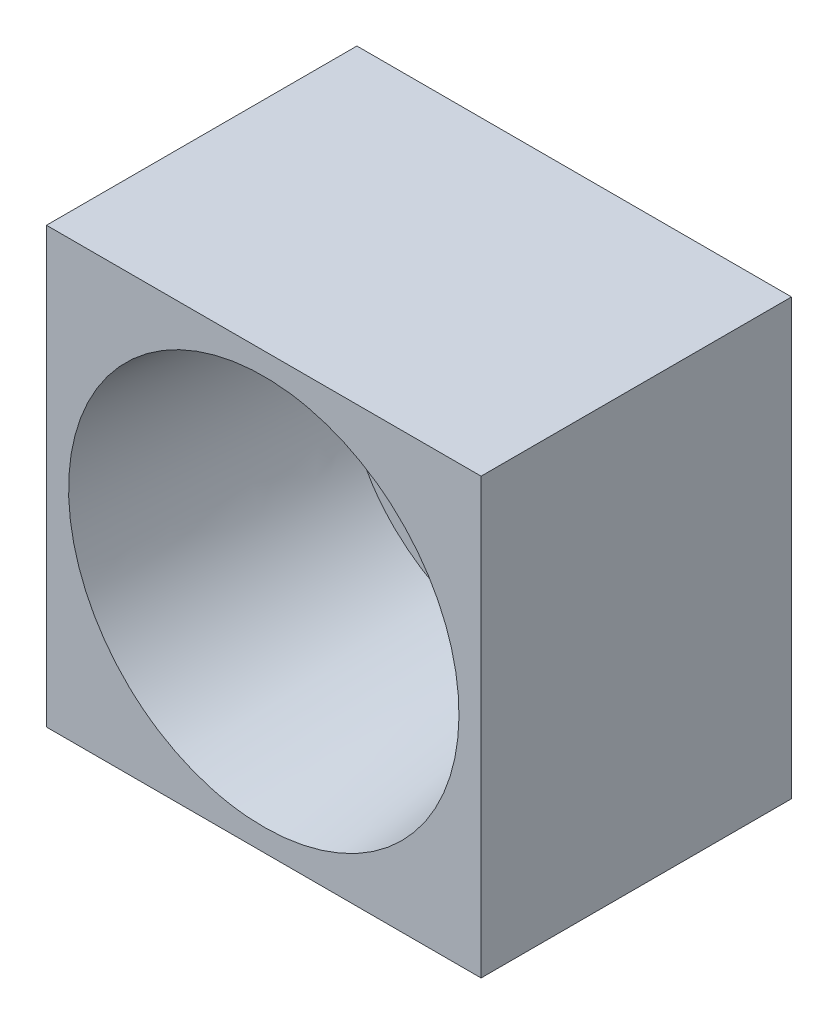
ISO-10303-21;
HEADER;
FILE_DESCRIPTION(('STEP AP214'),'2;1');
FILE_NAME('part.step','',(''),(''),'','','');
FILE_SCHEMA(('AUTOMOTIVE_DESIGN { 1 0 10303 214 1 1 1 1 }'));
ENDSEC;
DATA;
#1=APPLICATION_CONTEXT('core data for automotive mechanical design processes');
#2=APPLICATION_PROTOCOL_DEFINITION('international standard','automotive_design',2000,#1);
#3=PRODUCT_CONTEXT('',#1,'mechanical');
#4=PRODUCT('Part','Part','',(#3));
#5=PRODUCT_RELATED_PRODUCT_CATEGORY('part','',(#4));
#6=PRODUCT_DEFINITION_FORMATION('','',#4);
#7=PRODUCT_DEFINITION_CONTEXT('part definition',#1,'design');
#8=PRODUCT_DEFINITION('design','',#6,#7);
#9=PRODUCT_DEFINITION_SHAPE('','',#8);
#10=(LENGTH_UNIT() NAMED_UNIT(*) SI_UNIT(.MILLI.,.METRE.));
#11=(NAMED_UNIT(*) PLANE_ANGLE_UNIT() SI_UNIT($,.RADIAN.));
#12=(NAMED_UNIT(*) SI_UNIT($,.STERADIAN.) SOLID_ANGLE_UNIT());
#13=UNCERTAINTY_MEASURE_WITH_UNIT(LENGTH_MEASURE(1.E-05),#10,'distance_accuracy_value','');
#14=(GEOMETRIC_REPRESENTATION_CONTEXT(3) GLOBAL_UNCERTAINTY_ASSIGNED_CONTEXT((#13)) GLOBAL_UNIT_ASSIGNED_CONTEXT((#10,
#11,#12)) REPRESENTATION_CONTEXT('',''));
#15=CARTESIAN_POINT('',(0.,0.,0.));
#16=DIRECTION('',(0.,0.,1.));
#17=DIRECTION('',(1.,0.,0.));
#18=AXIS2_PLACEMENT_3D('',#15,#16,#17);
#19=CARTESIAN_POINT('',(0.,0.,50.));
#20=DIRECTION('',(-1.,0.,0.));
#21=DIRECTION('',(0.,-1.,0.));
#22=AXIS2_PLACEMENT_3D('',#19,#20,#21);
#23=PLANE('',#22);
#24=DIRECTION('',(0.,1.,0.));
#25=VECTOR('',#24,1.);
#26=CARTESIAN_POINT('',(0.,0.,0.));
#27=LINE('',#26,#25);
#28=CARTESIAN_POINT('',(0.,-70.,0.));
#29=VERTEX_POINT('',#28);
#30=CARTESIAN_POINT('',(0.,0.,0.));
#31=VERTEX_POINT('',#30);
#32=EDGE_CURVE('E103',#29,#31,#27,.T.);
#33=ORIENTED_EDGE('',*,*,#32,.T.);
#34=DIRECTION('',(0.,0.,-1.));
#35=VECTOR('',#34,1.);
#36=CARTESIAN_POINT('',(0.,0.,50.));
#37=LINE('',#36,#35);
#38=CARTESIAN_POINT('',(0.,0.,50.));
#39=VERTEX_POINT('',#38);
#40=EDGE_CURVE('E12',#39,#31,#37,.T.);
#41=ORIENTED_EDGE('',*,*,#40,.F.);
#42=DIRECTION('',(0.,1.,0.));
#43=VECTOR('',#42,1.);
#44=CARTESIAN_POINT('',(0.,0.,50.));
#45=LINE('',#44,#43);
#46=CARTESIAN_POINT('',(0.,-70.,50.));
#47=VERTEX_POINT('',#46);
#48=EDGE_CURVE('E91',#47,#39,#45,.T.);
#49=ORIENTED_EDGE('',*,*,#48,.F.);
#50=DIRECTION('',(0.,0.,-1.));
#51=VECTOR('',#50,1.);
#52=CARTESIAN_POINT('',(0.,-70.,50.));
#53=LINE('',#52,#51);
#54=EDGE_CURVE('E99',#47,#29,#53,.T.);
#55=ORIENTED_EDGE('',*,*,#54,.T.);
#56=EDGE_LOOP('',(#33,#41,#49,#55));
#57=FACE_BOUND('',#56,.T.);
#58=ADVANCED_FACE('F40',(#57),#23,.F.);
#59=CARTESIAN_POINT('',(0.,0.,50.));
#60=DIRECTION('',(0.,-1.,0.));
#61=DIRECTION('',(1.,0.,0.));
#62=AXIS2_PLACEMENT_3D('',#59,#60,#61);
#63=PLANE('',#62);
#64=DIRECTION('',(-1.,0.,0.));
#65=VECTOR('',#64,1.);
#66=CARTESIAN_POINT('',(0.,0.,0.));
#67=LINE('',#66,#65);
#68=CARTESIAN_POINT('',(-70.,0.,0.));
#69=VERTEX_POINT('',#68);
#70=EDGE_CURVE('E95',#31,#69,#67,.T.);
#71=ORIENTED_EDGE('',*,*,#70,.T.);
#72=DIRECTION('',(0.,0.,-1.));
#73=VECTOR('',#72,1.);
#74=CARTESIAN_POINT('',(-70.,0.,50.));
#75=LINE('',#74,#73);
#76=CARTESIAN_POINT('',(-70.,0.,50.));
#77=VERTEX_POINT('',#76);
#78=EDGE_CURVE('E48',#77,#69,#75,.T.);
#79=ORIENTED_EDGE('',*,*,#78,.F.);
#80=DIRECTION('',(-1.,0.,0.));
#81=VECTOR('',#80,1.);
#82=CARTESIAN_POINT('',(0.,0.,50.));
#83=LINE('',#82,#81);
#84=EDGE_CURVE('E86',#39,#77,#83,.T.);
#85=ORIENTED_EDGE('',*,*,#84,.F.);
#86=ORIENTED_EDGE('',*,*,#40,.T.);
#87=EDGE_LOOP('',(#71,#79,#85,#86));
#88=FACE_BOUND('',#87,.T.);
#89=ADVANCED_FACE('F94',(#88),#63,.F.);
#90=CARTESIAN_POINT('',(-70.,0.,50.));
#91=DIRECTION('',(1.,0.,0.));
#92=DIRECTION('',(0.,1.,0.));
#93=AXIS2_PLACEMENT_3D('',#90,#91,#92);
#94=PLANE('',#93);
#95=DIRECTION('',(0.,-1.,0.));
#96=VECTOR('',#95,1.);
#97=CARTESIAN_POINT('',(-70.,0.,0.));
#98=LINE('',#97,#96);
#99=CARTESIAN_POINT('',(-70.,-70.,0.));
#100=VERTEX_POINT('',#99);
#101=EDGE_CURVE('E73',#69,#100,#98,.T.);
#102=ORIENTED_EDGE('',*,*,#101,.T.);
#103=DIRECTION('',(0.,0.,-1.));
#104=VECTOR('',#103,1.);
#105=CARTESIAN_POINT('',(-70.,-70.,50.));
#106=LINE('',#105,#104);
#107=CARTESIAN_POINT('',(-70.,-70.,50.));
#108=VERTEX_POINT('',#107);
#109=EDGE_CURVE('E96',#108,#100,#106,.T.);
#110=ORIENTED_EDGE('',*,*,#109,.F.);
#111=DIRECTION('',(0.,-1.,0.));
#112=VECTOR('',#111,1.);
#113=CARTESIAN_POINT('',(-70.,0.,50.));
#114=LINE('',#113,#112);
#115=EDGE_CURVE('E89',#77,#108,#114,.T.);
#116=ORIENTED_EDGE('',*,*,#115,.F.);
#117=ORIENTED_EDGE('',*,*,#78,.T.);
#118=EDGE_LOOP('',(#102,#110,#116,#117));
#119=FACE_BOUND('',#118,.T.);
#120=ADVANCED_FACE('F97',(#119),#94,.F.);
#121=CARTESIAN_POINT('',(0.,-70.,50.));
#122=DIRECTION('',(0.,1.,0.));
#123=DIRECTION('',(-1.,0.,0.));
#124=AXIS2_PLACEMENT_3D('',#121,#122,#123);
#125=PLANE('',#124);
#126=DIRECTION('',(1.,0.,0.));
#127=VECTOR('',#126,1.);
#128=CARTESIAN_POINT('',(0.,-70.,0.));
#129=LINE('',#128,#127);
#130=EDGE_CURVE('E79',#100,#29,#129,.T.);
#131=ORIENTED_EDGE('',*,*,#130,.T.);
#132=ORIENTED_EDGE('',*,*,#54,.F.);
#133=DIRECTION('',(1.,0.,0.));
#134=VECTOR('',#133,1.);
#135=CARTESIAN_POINT('',(0.,-70.,50.));
#136=LINE('',#135,#134);
#137=EDGE_CURVE('E56',#108,#47,#136,.T.);
#138=ORIENTED_EDGE('',*,*,#137,.F.);
#139=ORIENTED_EDGE('',*,*,#109,.T.);
#140=EDGE_LOOP('',(#131,#132,#138,#139));
#141=FACE_BOUND('',#140,.T.);
#142=ADVANCED_FACE('F111',(#141),#125,.F.);
#143=CARTESIAN_POINT('',(0.,0.,50.));
#144=DIRECTION('',(0.,0.,-1.));
#145=DIRECTION('',(-1.,0.,0.));
#146=AXIS2_PLACEMENT_3D('',#143,#144,#145);
#147=PLANE('',#146);
#148=CARTESIAN_POINT('',(-35.,-35.,50.));
#149=DIRECTION('',(0.,0.,1.));
#150=DIRECTION('',(1.,0.,0.));
#151=AXIS2_PLACEMENT_3D('',#148,#149,#150);
#152=CIRCLE('',#151,31.4406587294673);
#153=CARTESIAN_POINT('',(-22.0797245840609,-6.33675690855778,50.));
#154=VERTEX_POINT('',#153);
#155=EDGE_CURVE('E106',#154,#154,#152,.T.);
#156=ORIENTED_EDGE('',*,*,#155,.F.);
#157=EDGE_LOOP('',(#156));
#158=FACE_BOUND('',#157,.T.);
#159=ORIENTED_EDGE('',*,*,#48,.T.);
#160=ORIENTED_EDGE('',*,*,#84,.T.);
#161=ORIENTED_EDGE('',*,*,#115,.T.);
#162=ORIENTED_EDGE('',*,*,#137,.T.);
#163=EDGE_LOOP('',(#159,#160,#161,#162));
#164=FACE_BOUND('',#163,.T.);
#165=ADVANCED_FACE('F87',(#158,#164),#147,.F.);
#166=CARTESIAN_POINT('',(0.,0.,0.));
#167=DIRECTION('',(0.,0.,-1.));
#168=DIRECTION('',(-1.,0.,0.));
#169=AXIS2_PLACEMENT_3D('',#166,#167,#168);
#170=PLANE('',#169);
#171=CARTESIAN_POINT('',(-27.5,-35.,0.));
#172=DIRECTION('',(0.,0.,-1.));
#173=DIRECTION('',(-1.,0.,0.));
#174=AXIS2_PLACEMENT_3D('',#171,#172,#173);
#175=CIRCLE('',#174,2.5);
#176=CARTESIAN_POINT('',(-30.,-35.,0.));
#177=VERTEX_POINT('',#176);
#178=EDGE_CURVE('E124',#177,#177,#175,.T.);
#179=ORIENTED_EDGE('',*,*,#178,.F.);
#180=EDGE_LOOP('',(#179));
#181=FACE_BOUND('',#180,.T.);
#182=CARTESIAN_POINT('',(-42.5,-35.,0.));
#183=DIRECTION('',(0.,0.,-1.));
#184=DIRECTION('',(-1.,0.,0.));
#185=AXIS2_PLACEMENT_3D('',#182,#183,#184);
#186=CIRCLE('',#185,2.5);
#187=CARTESIAN_POINT('',(-45.,-35.,0.));
#188=VERTEX_POINT('',#187);
#189=EDGE_CURVE('E168',#188,#188,#186,.T.);
#190=ORIENTED_EDGE('',*,*,#189,.F.);
#191=EDGE_LOOP('',(#190));
#192=FACE_BOUND('',#191,.T.);
#193=ORIENTED_EDGE('',*,*,#32,.F.);
#194=ORIENTED_EDGE('',*,*,#130,.F.);
#195=ORIENTED_EDGE('',*,*,#101,.F.);
#196=ORIENTED_EDGE('',*,*,#70,.F.);
#197=EDGE_LOOP('',(#193,#194,#195,#196));
#198=FACE_BOUND('',#197,.T.);
#199=ADVANCED_FACE('F114',(#181,#192,#198),#170,.T.);
#200=CARTESIAN_POINT('',(-35.,-35.,10.));
#201=DIRECTION('',(0.,0.,1.));
#202=DIRECTION('',(1.,0.,0.));
#203=AXIS2_PLACEMENT_3D('',#200,#201,#202);
#204=PLANE('',#203);
#205=CARTESIAN_POINT('',(-27.5,-35.,10.));
#206=DIRECTION('',(0.,0.,1.));
#207=DIRECTION('',(1.,0.,0.));
#208=AXIS2_PLACEMENT_3D('',#205,#206,#207);
#209=CIRCLE('',#208,2.5);
#210=CARTESIAN_POINT('',(-25.,-35.,10.));
#211=VERTEX_POINT('',#210);
#212=EDGE_CURVE('E171',#211,#211,#209,.T.);
#213=ORIENTED_EDGE('',*,*,#212,.F.);
#214=EDGE_LOOP('',(#213));
#215=FACE_BOUND('',#214,.T.);
#216=CARTESIAN_POINT('',(-42.5,-35.,10.));
#217=DIRECTION('',(0.,0.,1.));
#218=DIRECTION('',(-1.,0.,0.));
#219=AXIS2_PLACEMENT_3D('',#216,#217,#218);
#220=CIRCLE('',#219,2.5);
#221=CARTESIAN_POINT('',(-45.,-35.,10.));
#222=VERTEX_POINT('',#221);
#223=EDGE_CURVE('E172',#222,#222,#220,.T.);
#224=ORIENTED_EDGE('',*,*,#223,.F.);
#225=EDGE_LOOP('',(#224));
#226=FACE_BOUND('',#225,.T.);
#227=CARTESIAN_POINT('',(-35.,-35.,10.));
#228=DIRECTION('',(0.,0.,1.));
#229=DIRECTION('',(1.,0.,0.));
#230=AXIS2_PLACEMENT_3D('',#227,#228,#229);
#231=CIRCLE('',#230,27.);
#232=CARTESIAN_POINT('',(-19.3087460690092,-13.0276412264599,10.));
#233=VERTEX_POINT('',#232);
#234=EDGE_CURVE('E119',#233,#233,#231,.T.);
#235=ORIENTED_EDGE('',*,*,#234,.T.);
#236=EDGE_LOOP('',(#235));
#237=FACE_BOUND('',#236,.T.);
#238=ADVANCED_FACE('F130',(#215,#226,#237),#204,.T.);
#239=CARTESIAN_POINT('',(-19.3087460690092,-13.0276412264599,10.));
#240=CARTESIAN_POINT('',(-22.0797245840609,-6.33675690855778,50.));
#241=CARTESIAN_POINT('',(-63.2534636160894,18.3548666355217,10.));
#242=CARTESIAN_POINT('',(-79.4062107669454,19.5037939233204,50.));
#243=CARTESIAN_POINT('',(-94.6359714780711,-25.5898509115585,10.));
#244=CARTESIAN_POINT('',(-105.246761598824,-37.8226922595641,50.));
#245=CARTESIAN_POINT('',(-50.6912539309908,-56.9723587735401,10.));
#246=CARTESIAN_POINT('',(-47.9202754159391,-63.6632430914422,50.));
#247=CARTESIAN_POINT('',(-6.74653638391059,-88.3548666355217,10.));
#248=CARTESIAN_POINT('',(9.40621076694536,-89.5037939233204,50.));
#249=CARTESIAN_POINT('',(24.635971478071,-44.4101490884415,10.));
#250=CARTESIAN_POINT('',(35.2467615988235,-32.1773077404359,50.));
#251=CARTESIAN_POINT('',(-19.3087460690092,-13.0276412264599,10.));
#252=CARTESIAN_POINT('',(-22.0797245840609,-6.33675690855778,50.));
#253=(BOUNDED_SURFACE() B_SPLINE_SURFACE(3,1,((#239,#240),(#241,#242),(#243,#244),(#245,#246),
(#247,#248),(#249,#250),(#251,#252)),.UNSPECIFIED.,.T.,.F.,.F.) B_SPLINE_SURFACE_WITH_KNOTS((4,
3,4),(2,2),(0.,0.5,1.),(0.,1.),
.UNSPECIFIED.) GEOMETRIC_REPRESENTATION_ITEM() RATIONAL_B_SPLINE_SURFACE(((1.,1.),
(0.333333333333333,0.333333333333333),(0.333333333333333,0.333333333333333),(1.,1.),
(0.333333333333333,0.333333333333333),(0.333333333333333,0.333333333333333),(1.,1.))) REPRESENTATION_ITEM('') SURFACE());
#254=CARTESIAN_POINT('',(-19.3087460690092,-13.0276412264599,10.));
#255=CARTESIAN_POINT('',(-19.337610428541,-12.9579445148151,10.4166666666667));
#256=CARTESIAN_POINT('',(-19.3664747880728,-12.8882478031703,10.8333333333333));
#257=CARTESIAN_POINT('',(-19.4242035071363,-12.7488543798806,11.6666666666667));
#258=CARTESIAN_POINT('',(-19.4530678666681,-12.6791576682358,12.0833333333333));
#259=CARTESIAN_POINT('',(-19.5107965857317,-12.5397642449462,12.9166666666667));
#260=CARTESIAN_POINT('',(-19.5396609452635,-12.4700675333014,13.3333333333333));
#261=CARTESIAN_POINT('',(-19.5973896643271,-12.3306741100118,14.1666666666667));
#262=CARTESIAN_POINT('',(-19.6262540238589,-12.2609773983669,14.5833333333333));
#263=CARTESIAN_POINT('',(-19.6839827429224,-12.1215839750773,15.4166666666667));
#264=CARTESIAN_POINT('',(-19.7128471024542,-12.0518872634325,15.8333333333333));
#265=CARTESIAN_POINT('',(-19.7705758215178,-11.9124938401429,16.6666666666667));
#266=CARTESIAN_POINT('',(-19.7994401810496,-11.8427971284981,17.0833333333333));
#267=CARTESIAN_POINT('',(-19.8571689001132,-11.7034037052084,17.9166666666667));
#268=CARTESIAN_POINT('',(-19.886033259645,-11.6337069935636,18.3333333333333));
#269=CARTESIAN_POINT('',(-19.9437619787085,-11.494313570274,19.1666666666667));
#270=CARTESIAN_POINT('',(-19.9726263382403,-11.4246168586292,19.5833333333333));
#271=CARTESIAN_POINT('',(-20.0303550573039,-11.2852234353395,20.4166666666667));
#272=CARTESIAN_POINT('',(-20.0592194168357,-11.2155267236947,20.8333333333333));
#273=CARTESIAN_POINT('',(-20.1169481358993,-11.0761333004051,21.6666666666667));
#274=CARTESIAN_POINT('',(-20.1458124954311,-11.0064365887603,22.0833333333333));
#275=CARTESIAN_POINT('',(-20.2035412144946,-10.8670431654707,22.9166666666667));
#276=CARTESIAN_POINT('',(-20.2324055740264,-10.7973464538259,23.3333333333333));
#277=CARTESIAN_POINT('',(-20.29013429309,-10.6579530305362,24.1666666666667));
#278=CARTESIAN_POINT('',(-20.3189986526218,-10.5882563188914,24.5833333333333));
#279=CARTESIAN_POINT('',(-20.3767273716854,-10.4488628956018,25.4166666666667));
#280=CARTESIAN_POINT('',(-20.4055917312172,-10.379166183957,25.8333333333333));
#281=CARTESIAN_POINT('',(-20.4633204502807,-10.2397727606673,26.6666666666667));
#282=CARTESIAN_POINT('',(-20.4921848098125,-10.1700760490225,27.0833333333333));
#283=CARTESIAN_POINT('',(-20.5499135288761,-10.0306826257329,27.9166666666667));
#284=CARTESIAN_POINT('',(-20.5787778884079,-9.96098591408809,28.3333333333333));
#285=CARTESIAN_POINT('',(-20.6365066074715,-9.82159249079846,29.1666666666667));
#286=CARTESIAN_POINT('',(-20.6653709670033,-9.75189577915365,29.5833333333333));
#287=CARTESIAN_POINT('',(-20.7230996860668,-9.61250235586402,30.4166666666667));
#288=CARTESIAN_POINT('',(-20.7519640455986,-9.54280564421921,30.8333333333333));
#289=CARTESIAN_POINT('',(-20.8096927646622,-9.40341222092958,31.6666666666667));
#290=CARTESIAN_POINT('',(-20.838557124194,-9.33371550928477,32.0833333333333));
#291=CARTESIAN_POINT('',(-20.8962858432576,-9.19432208599514,32.9166666666667));
#292=CARTESIAN_POINT('',(-20.9251502027894,-9.12462537435032,33.3333333333333));
#293=CARTESIAN_POINT('',(-20.9828789218529,-8.9852319510607,34.1666666666667));
#294=CARTESIAN_POINT('',(-21.0117432813847,-8.91553523941588,34.5833333333333));
#295=CARTESIAN_POINT('',(-21.0694720004483,-8.77614181612626,35.4166666666667));
#296=CARTESIAN_POINT('',(-21.0983363599801,-8.70644510448144,35.8333333333333));
#297=CARTESIAN_POINT('',(-21.1560650790437,-8.56705168119181,36.6666666666667));
#298=CARTESIAN_POINT('',(-21.1849294385755,-8.497354969547,37.0833333333333));
#299=CARTESIAN_POINT('',(-21.242658157639,-8.35796154625737,37.9166666666667));
#300=CARTESIAN_POINT('',(-21.2715225171708,-8.28826483461256,38.3333333333333));
#301=CARTESIAN_POINT('',(-21.3292512362344,-8.14887141132293,39.1666666666667));
#302=CARTESIAN_POINT('',(-21.3581155957662,-8.07917469967812,39.5833333333333));
#303=CARTESIAN_POINT('',(-21.4158443148298,-7.93978127638849,40.4166666666667));
#304=CARTESIAN_POINT('',(-21.4447086743616,-7.87008456474368,40.8333333333333));
#305=CARTESIAN_POINT('',(-21.5024373934251,-7.73069114145405,41.6666666666667));
#306=CARTESIAN_POINT('',(-21.5313017529569,-7.66099442980924,42.0833333333333));
#307=CARTESIAN_POINT('',(-21.5890304720205,-7.52160100651961,42.9166666666667));
#308=CARTESIAN_POINT('',(-21.6178948315523,-7.4519042948748,43.3333333333333));
#309=CARTESIAN_POINT('',(-21.6756235506159,-7.31251087158517,44.1666666666667));
#310=CARTESIAN_POINT('',(-21.7044879101477,-7.24281415994035,44.5833333333333));
#311=CARTESIAN_POINT('',(-21.7622166292112,-7.10342073665073,45.4166666666667));
#312=CARTESIAN_POINT('',(-21.791080988743,-7.03372402500591,45.8333333333333));
#313=CARTESIAN_POINT('',(-21.8488097078066,-6.89433060171629,46.6666666666667));
#314=CARTESIAN_POINT('',(-21.8776740673384,-6.82463389007147,47.0833333333333));
#315=CARTESIAN_POINT('',(-21.935402786402,-6.68524046678184,47.9166666666667));
#316=CARTESIAN_POINT('',(-21.9642671459338,-6.61554375513703,48.3333333333333));
#317=CARTESIAN_POINT('',(-22.0219958649973,-6.4761503318474,49.1666666666667));
#318=CARTESIAN_POINT('',(-22.0508602245291,-6.40645362020259,49.5833333333333));
#319=CARTESIAN_POINT('',(-22.0797245840609,-6.33675690855778,50.));
#320=B_SPLINE_CURVE_WITH_KNOTS('',3,(#254,#255,#256,#257,#258,#259,#260,#261,#262,#263,#264,
#265,#266,#267,#268,#269,#270,#271,#272,#273,#274,#275,#276,#277,#278,#279,#280,#281,#282,#283,
#284,#285,#286,#287,#288,#289,#290,#291,#292,#293,#294,#295,#296,#297,#298,#299,#300,#301,#302,
#303,#304,#305,#306,#307,#308,#309,#310,#311,#312,#313,#314,#315,#316,#317,#318,#319),
.UNSPECIFIED.,.F.,.F.,(4,2,2,2,2,2,2,2,2,2,2,2,2,2,2,2,2,2,2,2,2,2,2,2,2,2,2,2,2,2,2,2,4),(0.,
1.27032163084296,2.54064326168593,3.81096489252889,5.08128652337185,6.35160815421481,
7.62192978505778,8.89225141590074,10.1625730467437,11.4328946775867,12.7032163084296,
13.9735379392726,15.2438595701156,16.5141812009585,17.7845028318015,19.0548244626445,
20.3251460934874,21.5954677243304,22.8657893551733,24.1361109860163,25.4064326168593,
26.6767542477022,27.9470758785452,29.2173975093882,30.4877191402311,31.7580407710741,
33.0283624019171,34.29868403276,35.569005663603,36.839327294446,38.1096489252889,
39.3799705561319,40.6502921869749),.UNSPECIFIED.);
#321=EDGE_CURVE('BSEAM140',#233,#154,#320,.T.);
#322=ORIENTED_EDGE('',*,*,#234,.F.);
#323=ORIENTED_EDGE('',*,*,#155,.T.);
#324=ORIENTED_EDGE('',*,*,#321,.T.);
#325=ORIENTED_EDGE('',*,*,#321,.F.);
#326=EDGE_LOOP('',(#322,#324,#323,#325));
#327=FACE_BOUND('',#326,.T.);
#328=ADVANCED_FACE('F140',(#327),#253,.F.);
#329=CARTESIAN_POINT('',(-42.5,-35.,-40.));
#330=DIRECTION('',(0.,0.,1.));
#331=DIRECTION('',(1.,0.,0.));
#332=AXIS2_PLACEMENT_3D('',#329,#330,#331);
#333=CYLINDRICAL_SURFACE('',#332,2.5);
#334=ORIENTED_EDGE('',*,*,#189,.T.);
#335=EDGE_LOOP('',(#334));
#336=FACE_BOUND('',#335,.T.);
#337=ORIENTED_EDGE('',*,*,#223,.T.);
#338=EDGE_LOOP('',(#337));
#339=FACE_BOUND('',#338,.T.);
#340=ADVANCED_FACE('F142',(#336,#339),#333,.F.);
#341=CARTESIAN_POINT('',(-27.5,-35.,-40.));
#342=DIRECTION('',(0.,0.,1.));
#343=DIRECTION('',(1.,0.,0.));
#344=AXIS2_PLACEMENT_3D('',#341,#342,#343);
#345=CYLINDRICAL_SURFACE('',#344,2.5);
#346=ORIENTED_EDGE('',*,*,#178,.T.);
#347=EDGE_LOOP('',(#346));
#348=FACE_BOUND('',#347,.T.);
#349=ORIENTED_EDGE('',*,*,#212,.T.);
#350=EDGE_LOOP('',(#349));
#351=FACE_BOUND('',#350,.T.);
#352=ADVANCED_FACE('F178',(#348,#351),#345,.F.);
#353=CLOSED_SHELL('',(#58,#89,#120,#142,#165,#199,#238,#328,#340,#352));
#354=MANIFOLD_SOLID_BREP('B2',#353);
#355=ADVANCED_BREP_SHAPE_REPRESENTATION('',(#18,#354),#14);
#356=SHAPE_DEFINITION_REPRESENTATION(#9,#355);
ENDSEC;
END-ISO-10303-21;
